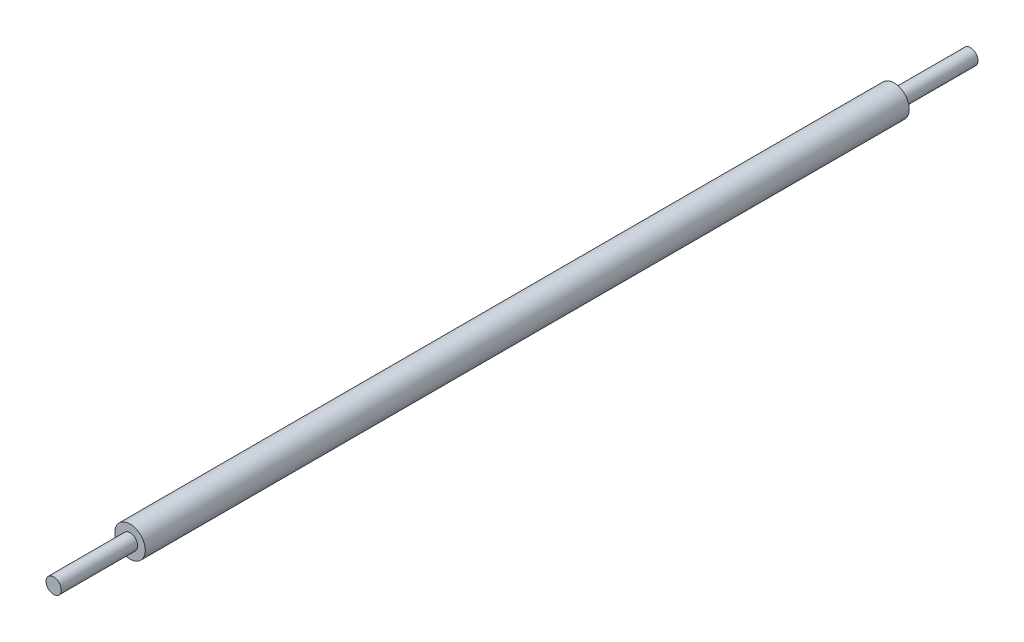
ISO-10303-21;
HEADER;
FILE_DESCRIPTION(('STEP AP214'),'2;1');
FILE_NAME('part.step','',(''),(''),'','','');
FILE_SCHEMA(('AUTOMOTIVE_DESIGN { 1 0 10303 214 1 1 1 1 }'));
ENDSEC;
DATA;
#1=APPLICATION_CONTEXT('core data for automotive mechanical design processes');
#2=APPLICATION_PROTOCOL_DEFINITION('international standard','automotive_design',2000,#1);
#3=PRODUCT_CONTEXT('',#1,'mechanical');
#4=PRODUCT('Part','Part','',(#3));
#5=PRODUCT_RELATED_PRODUCT_CATEGORY('part','',(#4));
#6=PRODUCT_DEFINITION_FORMATION('','',#4);
#7=PRODUCT_DEFINITION_CONTEXT('part definition',#1,'design');
#8=PRODUCT_DEFINITION('design','',#6,#7);
#9=PRODUCT_DEFINITION_SHAPE('','',#8);
#10=(LENGTH_UNIT() NAMED_UNIT(*) SI_UNIT(.MILLI.,.METRE.));
#11=(NAMED_UNIT(*) PLANE_ANGLE_UNIT() SI_UNIT($,.RADIAN.));
#12=(NAMED_UNIT(*) SI_UNIT($,.STERADIAN.) SOLID_ANGLE_UNIT());
#13=UNCERTAINTY_MEASURE_WITH_UNIT(LENGTH_MEASURE(1.E-05),#10,'distance_accuracy_value','');
#14=(GEOMETRIC_REPRESENTATION_CONTEXT(3) GLOBAL_UNCERTAINTY_ASSIGNED_CONTEXT((#13)) GLOBAL_UNIT_ASSIGNED_CONTEXT((#10,
#11,#12)) REPRESENTATION_CONTEXT('',''));
#15=CARTESIAN_POINT('',(0.,0.,0.));
#16=DIRECTION('',(0.,0.,1.));
#17=DIRECTION('',(1.,0.,0.));
#18=AXIS2_PLACEMENT_3D('',#15,#16,#17);
#19=CARTESIAN_POINT('',(0.,0.,2.5));
#20=DIRECTION('',(0.,0.,-1.));
#21=DIRECTION('',(-1.,0.,0.));
#22=AXIS2_PLACEMENT_3D('',#19,#20,#21);
#23=CYLINDRICAL_SURFACE('',#22,0.05);
#24=CARTESIAN_POINT('',(0.,0.,2.5));
#25=DIRECTION('',(0.,0.,1.));
#26=DIRECTION('',(1.,0.,0.));
#27=AXIS2_PLACEMENT_3D('',#24,#25,#26);
#28=CIRCLE('',#27,0.05);
#29=CARTESIAN_POINT('',(0.05,0.,2.5));
#30=VERTEX_POINT('',#29);
#31=EDGE_CURVE('E49',#30,#30,#28,.T.);
#32=ORIENTED_EDGE('',*,*,#31,.F.);
#33=EDGE_LOOP('',(#32));
#34=FACE_BOUND('',#33,.T.);
#35=CARTESIAN_POINT('',(0.,0.,0.));
#36=DIRECTION('',(0.,0.,1.));
#37=DIRECTION('',(1.,0.,0.));
#38=AXIS2_PLACEMENT_3D('',#35,#36,#37);
#39=CIRCLE('',#38,0.05);
#40=CARTESIAN_POINT('',(0.05,0.,0.));
#41=VERTEX_POINT('',#40);
#42=EDGE_CURVE('E40',#41,#41,#39,.T.);
#43=ORIENTED_EDGE('',*,*,#42,.T.);
#44=EDGE_LOOP('',(#43));
#45=FACE_BOUND('',#44,.T.);
#46=ADVANCED_FACE('F37',(#34,#45),#23,.T.);
#47=CARTESIAN_POINT('',(0.,0.,2.5));
#48=DIRECTION('',(0.,0.,1.));
#49=DIRECTION('',(1.,0.,0.));
#50=AXIS2_PLACEMENT_3D('',#47,#48,#49);
#51=PLANE('',#50);
#52=CARTESIAN_POINT('',(0.,0.,2.5));
#53=DIRECTION('',(0.,0.,1.));
#54=DIRECTION('',(1.,0.,0.));
#55=AXIS2_PLACEMENT_3D('',#52,#53,#54);
#56=CIRCLE('',#55,0.025);
#57=CARTESIAN_POINT('',(0.025,0.,2.5));
#58=VERTEX_POINT('',#57);
#59=EDGE_CURVE('E44',#58,#58,#56,.T.);
#60=ORIENTED_EDGE('',*,*,#59,.F.);
#61=EDGE_LOOP('',(#60));
#62=FACE_BOUND('',#61,.T.);
#63=ORIENTED_EDGE('',*,*,#31,.T.);
#64=EDGE_LOOP('',(#63));
#65=FACE_BOUND('',#64,.T.);
#66=ADVANCED_FACE('F66',(#62,#65),#51,.T.);
#67=CARTESIAN_POINT('',(0.,0.,0.));
#68=DIRECTION('',(0.,0.,1.));
#69=DIRECTION('',(1.,0.,0.));
#70=AXIS2_PLACEMENT_3D('',#67,#68,#69);
#71=PLANE('',#70);
#72=CARTESIAN_POINT('',(0.,0.,0.));
#73=DIRECTION('',(0.,0.,-1.));
#74=DIRECTION('',(-1.,0.,0.));
#75=AXIS2_PLACEMENT_3D('',#72,#73,#74);
#76=CIRCLE('',#75,0.025);
#77=CARTESIAN_POINT('',(-0.025,0.,0.));
#78=VERTEX_POINT('',#77);
#79=EDGE_CURVE('E10',#78,#78,#76,.T.);
#80=ORIENTED_EDGE('',*,*,#79,.F.);
#81=EDGE_LOOP('',(#80));
#82=FACE_BOUND('',#81,.T.);
#83=ORIENTED_EDGE('',*,*,#42,.F.);
#84=EDGE_LOOP('',(#83));
#85=FACE_BOUND('',#84,.T.);
#86=ADVANCED_FACE('F63',(#82,#85),#71,.F.);
#87=CARTESIAN_POINT('',(0.,0.,2.75));
#88=DIRECTION('',(0.,0.,-1.));
#89=DIRECTION('',(-1.,0.,0.));
#90=AXIS2_PLACEMENT_3D('',#87,#88,#89);
#91=CYLINDRICAL_SURFACE('',#90,0.025);
#92=CARTESIAN_POINT('',(0.,0.,2.75));
#93=DIRECTION('',(0.,0.,1.));
#94=DIRECTION('',(1.,0.,0.));
#95=AXIS2_PLACEMENT_3D('',#92,#93,#94);
#96=CIRCLE('',#95,0.025);
#97=CARTESIAN_POINT('',(0.025,0.,2.75));
#98=VERTEX_POINT('',#97);
#99=EDGE_CURVE('E54',#98,#98,#96,.T.);
#100=ORIENTED_EDGE('',*,*,#99,.F.);
#101=EDGE_LOOP('',(#100));
#102=FACE_BOUND('',#101,.T.);
#103=ORIENTED_EDGE('',*,*,#59,.T.);
#104=EDGE_LOOP('',(#103));
#105=FACE_BOUND('',#104,.T.);
#106=ADVANCED_FACE('F65',(#102,#105),#91,.T.);
#107=CARTESIAN_POINT('',(0.,0.,2.75));
#108=DIRECTION('',(0.,0.,1.));
#109=DIRECTION('',(1.,0.,0.));
#110=AXIS2_PLACEMENT_3D('',#107,#108,#109);
#111=PLANE('',#110);
#112=ORIENTED_EDGE('',*,*,#99,.T.);
#113=EDGE_LOOP('',(#112));
#114=FACE_BOUND('',#113,.T.);
#115=ADVANCED_FACE('F73',(#114),#111,.T.);
#116=CARTESIAN_POINT('',(0.,0.,-0.25));
#117=DIRECTION('',(0.,0.,1.));
#118=DIRECTION('',(1.,0.,0.));
#119=AXIS2_PLACEMENT_3D('',#116,#117,#118);
#120=CYLINDRICAL_SURFACE('',#119,0.025);
#121=CARTESIAN_POINT('',(0.,0.,-0.25));
#122=DIRECTION('',(0.,0.,-1.));
#123=DIRECTION('',(-1.,0.,0.));
#124=AXIS2_PLACEMENT_3D('',#121,#122,#123);
#125=CIRCLE('',#124,0.025);
#126=CARTESIAN_POINT('',(-0.025,0.,-0.25));
#127=VERTEX_POINT('',#126);
#128=EDGE_CURVE('E53',#127,#127,#125,.T.);
#129=ORIENTED_EDGE('',*,*,#128,.F.);
#130=EDGE_LOOP('',(#129));
#131=FACE_BOUND('',#130,.T.);
#132=ORIENTED_EDGE('',*,*,#79,.T.);
#133=EDGE_LOOP('',(#132));
#134=FACE_BOUND('',#133,.T.);
#135=ADVANCED_FACE('F98',(#131,#134),#120,.T.);
#136=CARTESIAN_POINT('',(0.,0.,-0.25));
#137=DIRECTION('',(0.,0.,-1.));
#138=DIRECTION('',(-1.,0.,0.));
#139=AXIS2_PLACEMENT_3D('',#136,#137,#138);
#140=PLANE('',#139);
#141=ORIENTED_EDGE('',*,*,#128,.T.);
#142=EDGE_LOOP('',(#141));
#143=FACE_BOUND('',#142,.T.);
#144=ADVANCED_FACE('F110',(#143),#140,.T.);
#145=CLOSED_SHELL('',(#46,#66,#86,#106,#115,#135,#144));
#146=MANIFOLD_SOLID_BREP('B2',#145);
#147=ADVANCED_BREP_SHAPE_REPRESENTATION('',(#18,#146),#14);
#148=SHAPE_DEFINITION_REPRESENTATION(#9,#147);
ENDSEC;
END-ISO-10303-21;
